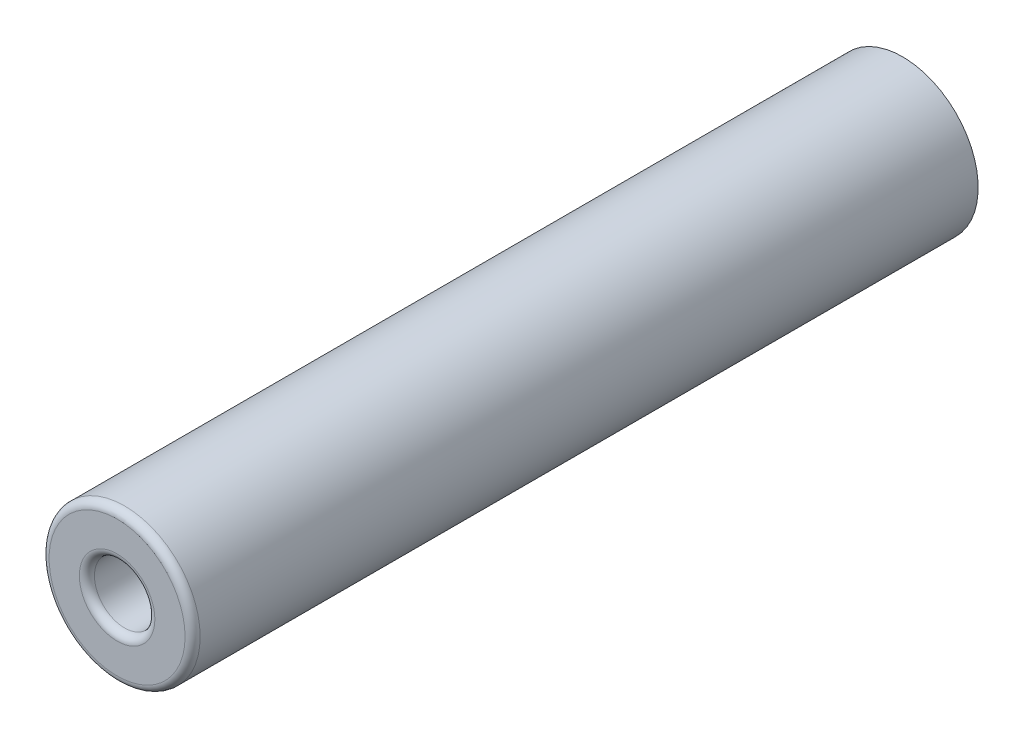
ISO-10303-21;
HEADER;
FILE_DESCRIPTION(('STEP AP214'),'2;1');
FILE_NAME('part.step','',(''),(''),'','','');
FILE_SCHEMA(('AUTOMOTIVE_DESIGN { 1 0 10303 214 1 1 1 1 }'));
ENDSEC;
DATA;
#1=APPLICATION_CONTEXT('core data for automotive mechanical design processes');
#2=APPLICATION_PROTOCOL_DEFINITION('international standard','automotive_design',2000,#1);
#3=PRODUCT_CONTEXT('',#1,'mechanical');
#4=PRODUCT('Part','Part','',(#3));
#5=PRODUCT_RELATED_PRODUCT_CATEGORY('part','',(#4));
#6=PRODUCT_DEFINITION_FORMATION('','',#4);
#7=PRODUCT_DEFINITION_CONTEXT('part definition',#1,'design');
#8=PRODUCT_DEFINITION('design','',#6,#7);
#9=PRODUCT_DEFINITION_SHAPE('','',#8);
#10=(LENGTH_UNIT() NAMED_UNIT(*) SI_UNIT(.MILLI.,.METRE.));
#11=(NAMED_UNIT(*) PLANE_ANGLE_UNIT() SI_UNIT($,.RADIAN.));
#12=(NAMED_UNIT(*) SI_UNIT($,.STERADIAN.) SOLID_ANGLE_UNIT());
#13=UNCERTAINTY_MEASURE_WITH_UNIT(LENGTH_MEASURE(1.E-05),#10,'distance_accuracy_value','');
#14=(GEOMETRIC_REPRESENTATION_CONTEXT(3) GLOBAL_UNCERTAINTY_ASSIGNED_CONTEXT((#13)) GLOBAL_UNIT_ASSIGNED_CONTEXT((#10,
#11,#12)) REPRESENTATION_CONTEXT('',''));
#15=CARTESIAN_POINT('',(0.,0.,0.));
#16=DIRECTION('',(0.,0.,1.));
#17=DIRECTION('',(1.,0.,0.));
#18=AXIS2_PLACEMENT_3D('',#15,#16,#17);
#19=CARTESIAN_POINT('',(0.,0.,26.));
#20=DIRECTION('',(0.,0.,-1.));
#21=DIRECTION('',(-1.,0.,0.));
#22=AXIS2_PLACEMENT_3D('',#19,#20,#21);
#23=CYLINDRICAL_SURFACE('',#22,2.5);
#24=CARTESIAN_POINT('',(0.,0.,25.75));
#25=DIRECTION('',(0.,0.,1.));
#26=DIRECTION('',(1.,0.,0.));
#27=AXIS2_PLACEMENT_3D('',#24,#25,#26);
#28=CIRCLE('',#27,2.5);
#29=CARTESIAN_POINT('',(-2.5,0.,25.75));
#30=VERTEX_POINT('',#29);
#31=EDGE_CURVE('E38',#30,#30,#28,.F.);
#32=CARTESIAN_POINT('',(0.,0.,0.));
#33=DIRECTION('',(0.,0.,1.));
#34=DIRECTION('',(1.,0.,0.));
#35=AXIS2_PLACEMENT_3D('',#32,#33,#34);
#36=CIRCLE('',#35,2.5);
#37=CARTESIAN_POINT('',(-2.5,0.,0.));
#38=VERTEX_POINT('',#37);
#39=EDGE_CURVE('E51',#38,#38,#36,.T.);
#40=CARTESIAN_POINT('',(-2.5,0.,25.75));
#41=CARTESIAN_POINT('',(-2.5,0.,25.4817708333333));
#42=CARTESIAN_POINT('',(-2.5,0.,25.2135416666667));
#43=CARTESIAN_POINT('',(-2.5,0.,24.6770833333333));
#44=CARTESIAN_POINT('',(-2.5,0.,24.4088541666667));
#45=CARTESIAN_POINT('',(-2.5,0.,23.8723958333333));
#46=CARTESIAN_POINT('',(-2.5,0.,23.6041666666667));
#47=CARTESIAN_POINT('',(-2.5,0.,23.0677083333333));
#48=CARTESIAN_POINT('',(-2.5,0.,22.7994791666667));
#49=CARTESIAN_POINT('',(-2.5,0.,22.2630208333333));
#50=CARTESIAN_POINT('',(-2.5,0.,21.9947916666667));
#51=CARTESIAN_POINT('',(-2.5,0.,21.4583333333333));
#52=CARTESIAN_POINT('',(-2.5,0.,21.1901041666667));
#53=CARTESIAN_POINT('',(-2.5,0.,20.6536458333333));
#54=CARTESIAN_POINT('',(-2.5,0.,20.3854166666667));
#55=CARTESIAN_POINT('',(-2.5,0.,19.8489583333333));
#56=CARTESIAN_POINT('',(-2.5,0.,19.5807291666667));
#57=CARTESIAN_POINT('',(-2.5,0.,19.0442708333333));
#58=CARTESIAN_POINT('',(-2.5,0.,18.7760416666667));
#59=CARTESIAN_POINT('',(-2.5,0.,18.2395833333333));
#60=CARTESIAN_POINT('',(-2.5,0.,17.9713541666667));
#61=CARTESIAN_POINT('',(-2.5,0.,17.4348958333333));
#62=CARTESIAN_POINT('',(-2.5,0.,17.1666666666667));
#63=CARTESIAN_POINT('',(-2.5,0.,16.6302083333333));
#64=CARTESIAN_POINT('',(-2.5,0.,16.3619791666667));
#65=CARTESIAN_POINT('',(-2.5,0.,15.8255208333333));
#66=CARTESIAN_POINT('',(-2.5,0.,15.5572916666667));
#67=CARTESIAN_POINT('',(-2.5,0.,15.0208333333333));
#68=CARTESIAN_POINT('',(-2.5,0.,14.7526041666667));
#69=CARTESIAN_POINT('',(-2.5,0.,14.2161458333333));
#70=CARTESIAN_POINT('',(-2.5,0.,13.9479166666667));
#71=CARTESIAN_POINT('',(-2.5,0.,13.4114583333333));
#72=CARTESIAN_POINT('',(-2.5,0.,13.1432291666667));
#73=CARTESIAN_POINT('',(-2.5,0.,12.6067708333333));
#74=CARTESIAN_POINT('',(-2.5,0.,12.3385416666667));
#75=CARTESIAN_POINT('',(-2.5,0.,11.8020833333333));
#76=CARTESIAN_POINT('',(-2.5,0.,11.5338541666667));
#77=CARTESIAN_POINT('',(-2.5,0.,10.9973958333333));
#78=CARTESIAN_POINT('',(-2.5,0.,10.7291666666667));
#79=CARTESIAN_POINT('',(-2.5,0.,10.1927083333333));
#80=CARTESIAN_POINT('',(-2.5,0.,9.92447916666666));
#81=CARTESIAN_POINT('',(-2.5,0.,9.38802083333333));
#82=CARTESIAN_POINT('',(-2.5,0.,9.11979166666667));
#83=CARTESIAN_POINT('',(-2.5,0.,8.58333333333333));
#84=CARTESIAN_POINT('',(-2.5,0.,8.31510416666667));
#85=CARTESIAN_POINT('',(-2.5,0.,7.77864583333333));
#86=CARTESIAN_POINT('',(-2.5,0.,7.51041666666667));
#87=CARTESIAN_POINT('',(-2.5,0.,6.97395833333333));
#88=CARTESIAN_POINT('',(-2.5,0.,6.70572916666666));
#89=CARTESIAN_POINT('',(-2.5,0.,6.16927083333333));
#90=CARTESIAN_POINT('',(-2.5,0.,5.90104166666667));
#91=CARTESIAN_POINT('',(-2.5,0.,5.36458333333333));
#92=CARTESIAN_POINT('',(-2.5,0.,5.09635416666666));
#93=CARTESIAN_POINT('',(-2.5,0.,4.55989583333333));
#94=CARTESIAN_POINT('',(-2.5,0.,4.29166666666666));
#95=CARTESIAN_POINT('',(-2.5,0.,3.75520833333333));
#96=CARTESIAN_POINT('',(-2.5,0.,3.48697916666667));
#97=CARTESIAN_POINT('',(-2.5,0.,2.95052083333333));
#98=CARTESIAN_POINT('',(-2.5,0.,2.68229166666667));
#99=CARTESIAN_POINT('',(-2.5,0.,2.14583333333333));
#100=CARTESIAN_POINT('',(-2.5,0.,1.87760416666666));
#101=CARTESIAN_POINT('',(-2.5,0.,1.34114583333333));
#102=CARTESIAN_POINT('',(-2.5,0.,1.07291666666666));
#103=CARTESIAN_POINT('',(-2.5,0.,0.536458333333332));
#104=CARTESIAN_POINT('',(-2.5,0.,0.268229166666666));
#105=CARTESIAN_POINT('',(-2.5,0.,0.));
#106=B_SPLINE_CURVE_WITH_KNOTS('',3,(#40,#41,#42,#43,#44,#45,#46,#47,#48,#49,#50,#51,#52,#53,
#54,#55,#56,#57,#58,#59,#60,#61,#62,#63,#64,#65,#66,#67,#68,#69,#70,#71,#72,#73,#74,#75,#76,#77,
#78,#79,#80,#81,#82,#83,#84,#85,#86,#87,#88,#89,#90,#91,#92,#93,#94,#95,#96,#97,#98,#99,#100,
#101,#102,#103,#104,#105),.UNSPECIFIED.,.F.,.F.,(4,2,2,2,2,2,2,2,2,2,2,2,2,2,2,2,2,2,2,2,2,2,2,
2,2,2,2,2,2,2,2,2,4),(0.,0.804687500000002,1.609375,2.4140625,3.21875,4.0234375,4.828125,
5.6328125,6.4375,7.2421875,8.046875,8.8515625,9.65625,10.4609375,11.265625,12.0703125,12.875,
13.6796875,14.484375,15.2890625,16.09375,16.8984375,17.703125,18.5078125,19.3125,20.1171875,
20.921875,21.7265625,22.53125,23.3359375,24.140625,24.9453125,25.75),.UNSPECIFIED.);
#107=EDGE_CURVE('BSEAM31',#30,#38,#106,.T.);
#108=ORIENTED_EDGE('',*,*,#31,.T.);
#109=ORIENTED_EDGE('',*,*,#39,.T.);
#110=ORIENTED_EDGE('',*,*,#107,.T.);
#111=ORIENTED_EDGE('',*,*,#107,.F.);
#112=EDGE_LOOP('',(#108,#110,#109,#111));
#113=FACE_BOUND('',#112,.T.);
#114=ADVANCED_FACE('F31',(#113),#23,.T.);
#115=CARTESIAN_POINT('',(0.,0.,26.));
#116=DIRECTION('',(0.,0.,1.));
#117=DIRECTION('',(1.,0.,0.));
#118=AXIS2_PLACEMENT_3D('',#115,#116,#117);
#119=PLANE('',#118);
#120=CARTESIAN_POINT('',(0.,0.,26.));
#121=DIRECTION('',(0.,0.,1.));
#122=DIRECTION('',(1.,0.,0.));
#123=AXIS2_PLACEMENT_3D('',#120,#121,#122);
#124=CIRCLE('',#123,2.25);
#125=CARTESIAN_POINT('',(2.25,0.,26.));
#126=VERTEX_POINT('',#125);
#127=EDGE_CURVE('E42',#126,#126,#124,.T.);
#128=ORIENTED_EDGE('',*,*,#127,.T.);
#129=EDGE_LOOP('',(#128));
#130=FACE_BOUND('',#129,.T.);
#131=CARTESIAN_POINT('',(0.,0.,26.));
#132=DIRECTION('',(0.,0.,1.));
#133=DIRECTION('',(1.,0.,0.));
#134=AXIS2_PLACEMENT_3D('',#131,#132,#133);
#135=CIRCLE('',#134,1.25);
#136=CARTESIAN_POINT('',(1.25,0.,26.));
#137=VERTEX_POINT('',#136);
#138=EDGE_CURVE('E46',#137,#137,#135,.F.);
#139=ORIENTED_EDGE('',*,*,#138,.T.);
#140=EDGE_LOOP('',(#139));
#141=FACE_BOUND('',#140,.T.);
#142=ADVANCED_FACE('F70',(#130,#141),#119,.T.);
#143=CARTESIAN_POINT('',(0.,0.,0.));
#144=DIRECTION('',(0.,0.,1.));
#145=DIRECTION('',(1.,0.,0.));
#146=AXIS2_PLACEMENT_3D('',#143,#144,#145);
#147=PLANE('',#146);
#148=ORIENTED_EDGE('',*,*,#39,.F.);
#149=EDGE_LOOP('',(#148));
#150=FACE_BOUND('',#149,.T.);
#151=ADVANCED_FACE('F62',(#150),#147,.F.);
#152=CARTESIAN_POINT('',(0.,0.,16.));
#153=DIRECTION('',(0.,0.,1.));
#154=DIRECTION('',(1.,0.,0.));
#155=AXIS2_PLACEMENT_3D('',#152,#153,#154);
#156=CYLINDRICAL_SURFACE('',#155,1.);
#157=CARTESIAN_POINT('',(0.,0.,25.75));
#158=DIRECTION('',(0.,0.,1.));
#159=DIRECTION('',(1.,0.,0.));
#160=AXIS2_PLACEMENT_3D('',#157,#158,#159);
#161=CIRCLE('',#160,1.);
#162=CARTESIAN_POINT('',(1.,0.,25.75));
#163=VERTEX_POINT('',#162);
#164=EDGE_CURVE('E10',#163,#163,#161,.T.);
#165=ORIENTED_EDGE('',*,*,#164,.T.);
#166=EDGE_LOOP('',(#165));
#167=FACE_BOUND('',#166,.T.);
#168=CARTESIAN_POINT('',(0.,0.,16.));
#169=DIRECTION('',(0.,0.,1.));
#170=DIRECTION('',(1.,0.,0.));
#171=AXIS2_PLACEMENT_3D('',#168,#169,#170);
#172=CIRCLE('',#171,1.);
#173=CARTESIAN_POINT('',(1.,0.,16.));
#174=VERTEX_POINT('',#173);
#175=EDGE_CURVE('E54',#174,#174,#172,.T.);
#176=ORIENTED_EDGE('',*,*,#175,.F.);
#177=EDGE_LOOP('',(#176));
#178=FACE_BOUND('',#177,.T.);
#179=ADVANCED_FACE('F60',(#167,#178),#156,.F.);
#180=CARTESIAN_POINT('',(0.,0.,16.));
#181=DIRECTION('',(0.,0.,1.));
#182=DIRECTION('',(1.,0.,0.));
#183=AXIS2_PLACEMENT_3D('',#180,#181,#182);
#184=PLANE('',#183);
#185=ORIENTED_EDGE('',*,*,#175,.T.);
#186=EDGE_LOOP('',(#185));
#187=FACE_BOUND('',#186,.T.);
#188=ADVANCED_FACE('F58',(#187),#184,.T.);
#189=CARTESIAN_POINT('',(0.,0.,25.75));
#190=DIRECTION('',(0.,0.,1.));
#191=DIRECTION('',(1.,0.,0.));
#192=AXIS2_PLACEMENT_3D('',#189,#190,#191);
#193=TOROIDAL_SURFACE('',#192,2.25,0.25);
#194=ORIENTED_EDGE('',*,*,#31,.F.);
#195=EDGE_LOOP('',(#194));
#196=FACE_BOUND('',#195,.T.);
#197=ORIENTED_EDGE('',*,*,#127,.F.);
#198=EDGE_LOOP('',(#197));
#199=FACE_BOUND('',#198,.T.);
#200=ADVANCED_FACE('F68',(#196,#199),#193,.T.);
#201=CARTESIAN_POINT('',(0.,0.,25.75));
#202=DIRECTION('',(0.,0.,1.));
#203=DIRECTION('',(1.,0.,0.));
#204=AXIS2_PLACEMENT_3D('',#201,#202,#203);
#205=TOROIDAL_SURFACE('',#204,1.25,0.25);
#206=ORIENTED_EDGE('',*,*,#138,.F.);
#207=EDGE_LOOP('',(#206));
#208=FACE_BOUND('',#207,.T.);
#209=ORIENTED_EDGE('',*,*,#164,.F.);
#210=EDGE_LOOP('',(#209));
#211=FACE_BOUND('',#210,.T.);
#212=ADVANCED_FACE('F33',(#208,#211),#205,.T.);
#213=CLOSED_SHELL('',(#114,#142,#151,#179,#188,#200,#212));
#214=MANIFOLD_SOLID_BREP('B2',#213);
#215=ADVANCED_BREP_SHAPE_REPRESENTATION('',(#18,#214),#14);
#216=SHAPE_DEFINITION_REPRESENTATION(#9,#215);
ENDSEC;
END-ISO-10303-21;
